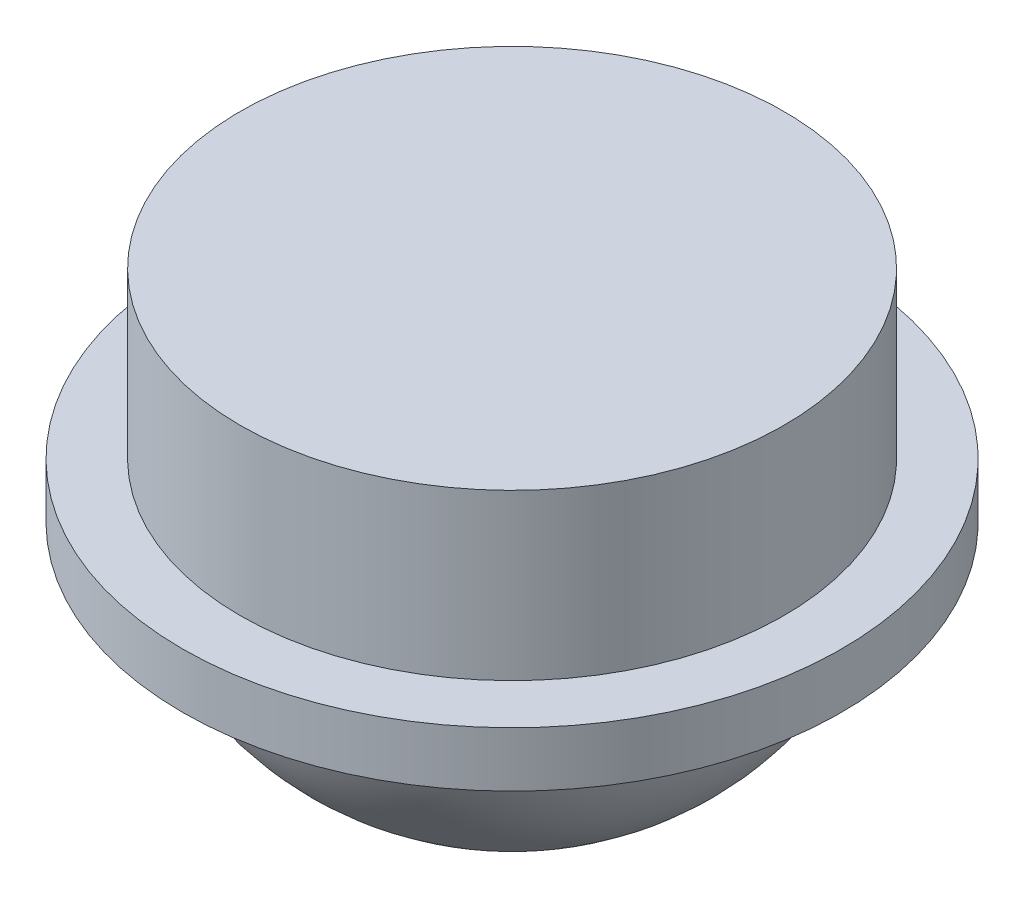
ISO-10303-21;
HEADER;
FILE_DESCRIPTION(('STEP AP214'),'2;1');
FILE_NAME('part.step','',(''),(''),'','','');
FILE_SCHEMA(('AUTOMOTIVE_DESIGN { 1 0 10303 214 1 1 1 1 }'));
ENDSEC;
DATA;
#1=APPLICATION_CONTEXT('core data for automotive mechanical design processes');
#2=APPLICATION_PROTOCOL_DEFINITION('international standard','automotive_design',2000,#1);
#3=PRODUCT_CONTEXT('',#1,'mechanical');
#4=PRODUCT('Part','Part','',(#3));
#5=PRODUCT_RELATED_PRODUCT_CATEGORY('part','',(#4));
#6=PRODUCT_DEFINITION_FORMATION('','',#4);
#7=PRODUCT_DEFINITION_CONTEXT('part definition',#1,'design');
#8=PRODUCT_DEFINITION('design','',#6,#7);
#9=PRODUCT_DEFINITION_SHAPE('','',#8);
#10=(LENGTH_UNIT() NAMED_UNIT(*) SI_UNIT(.MILLI.,.METRE.));
#11=(NAMED_UNIT(*) PLANE_ANGLE_UNIT() SI_UNIT($,.RADIAN.));
#12=(NAMED_UNIT(*) SI_UNIT($,.STERADIAN.) SOLID_ANGLE_UNIT());
#13=UNCERTAINTY_MEASURE_WITH_UNIT(LENGTH_MEASURE(1.E-05),#10,'distance_accuracy_value','');
#14=(GEOMETRIC_REPRESENTATION_CONTEXT(3) GLOBAL_UNCERTAINTY_ASSIGNED_CONTEXT((#13)) GLOBAL_UNIT_ASSIGNED_CONTEXT((#10,
#11,#12)) REPRESENTATION_CONTEXT('',''));
#15=CARTESIAN_POINT('',(0.,0.,0.));
#16=DIRECTION('',(0.,0.,1.));
#17=DIRECTION('',(1.,0.,0.));
#18=AXIS2_PLACEMENT_3D('',#15,#16,#17);
#19=CARTESIAN_POINT('',(60.0000008940697,-18.1999999999999,-44.1000000000083));
#20=DIRECTION('',(0.,1.,0.));
#21=DIRECTION('',(0.,0.,1.));
#22=AXIS2_PLACEMENT_3D('',#19,#20,#21);
#23=DEGENERATE_TOROIDAL_SURFACE('',#22,0.101020514433607,5.00000000000007,.T.);
#24=CARTESIAN_POINT('',(60.0000008940697,-23.2,-44.1000000000083));
#25=DIRECTION('',(0.,1.,0.));
#26=DIRECTION('',(0.,0.,1.));
#27=AXIS2_PLACEMENT_3D('',#24,#25,#26);
#28=CIRCLE('',#27,0.1010205144336);
#29=CARTESIAN_POINT('',(60.0000008940697,-23.2,-43.9989794855747));
#30=VERTEX_POINT('',#29);
#31=EDGE_CURVE('E10',#30,#30,#28,.T.);
#32=ORIENTED_EDGE('',*,*,#31,.T.);
#33=EDGE_LOOP('',(#32));
#34=FACE_BOUND('',#33,.T.);
#35=CARTESIAN_POINT('',(60.0000008940697,-19.2,-44.1000000000083));
#36=DIRECTION('',(0.,1.,0.));
#37=DIRECTION('',(0.,0.,1.));
#38=AXIS2_PLACEMENT_3D('',#35,#36,#37);
#39=CIRCLE('',#38,5.00000000000001);
#40=CARTESIAN_POINT('',(60.0000008940697,-19.2,-39.1000000000083));
#41=VERTEX_POINT('',#40);
#42=EDGE_CURVE('E53',#41,#41,#39,.T.);
#43=ORIENTED_EDGE('',*,*,#42,.F.);
#44=EDGE_LOOP('',(#43));
#45=FACE_BOUND('',#44,.T.);
#46=ADVANCED_FACE('F31',(#34,#45),#23,.T.);
#47=CARTESIAN_POINT('',(60.1010214085033,-23.2,-44.1000000000083));
#48=DIRECTION('',(0.,-1.,0.));
#49=DIRECTION('',(0.,0.,-1.));
#50=AXIS2_PLACEMENT_3D('',#47,#48,#49);
#51=PLANE('',#50);
#52=ORIENTED_EDGE('',*,*,#31,.F.);
#53=EDGE_LOOP('',(#52));
#54=FACE_BOUND('',#53,.T.);
#55=ADVANCED_FACE('F61',(#54),#51,.T.);
#56=CARTESIAN_POINT('',(60.0000008940697,-15.2,-44.1000000000083));
#57=DIRECTION('',(0.,1.,0.));
#58=DIRECTION('',(0.,0.,1.));
#59=AXIS2_PLACEMENT_3D('',#56,#57,#58);
#60=PLANE('',#59);
#61=CARTESIAN_POINT('',(60.0000008940697,-15.2,-44.1000000000083));
#62=DIRECTION('',(0.,1.,0.));
#63=DIRECTION('',(0.,0.,1.));
#64=AXIS2_PLACEMENT_3D('',#61,#62,#63);
#65=CIRCLE('',#64,4.95);
#66=CARTESIAN_POINT('',(60.0000008940697,-15.2,-39.1500000000083));
#67=VERTEX_POINT('',#66);
#68=EDGE_CURVE('E37',#67,#67,#65,.T.);
#69=ORIENTED_EDGE('',*,*,#68,.T.);
#70=EDGE_LOOP('',(#69));
#71=FACE_BOUND('',#70,.T.);
#72=ADVANCED_FACE('F65',(#71),#60,.T.);
#73=CARTESIAN_POINT('',(60.0000008940697,-23.2,-44.1000000000083));
#74=DIRECTION('',(0.,1.,0.));
#75=DIRECTION('',(0.,0.,1.));
#76=AXIS2_PLACEMENT_3D('',#73,#74,#75);
#77=CYLINDRICAL_SURFACE('',#76,4.95);
#78=CARTESIAN_POINT('',(60.0000008940697,-18.2,-44.1000000000083));
#79=DIRECTION('',(0.,1.,0.));
#80=DIRECTION('',(0.,0.,1.));
#81=AXIS2_PLACEMENT_3D('',#78,#79,#80);
#82=CIRCLE('',#81,4.95);
#83=CARTESIAN_POINT('',(60.0000008940697,-18.2,-39.1500000000083));
#84=VERTEX_POINT('',#83);
#85=EDGE_CURVE('E41',#84,#84,#82,.T.);
#86=ORIENTED_EDGE('',*,*,#85,.T.);
#87=EDGE_LOOP('',(#86));
#88=FACE_BOUND('',#87,.T.);
#89=ORIENTED_EDGE('',*,*,#68,.F.);
#90=EDGE_LOOP('',(#89));
#91=FACE_BOUND('',#90,.T.);
#92=ADVANCED_FACE('F70',(#88,#91),#77,.T.);
#93=CARTESIAN_POINT('',(64.9500008940697,-18.2,-44.1000000000083));
#94=DIRECTION('',(0.,1.,0.));
#95=DIRECTION('',(0.,0.,1.));
#96=AXIS2_PLACEMENT_3D('',#93,#94,#95);
#97=PLANE('',#96);
#98=CARTESIAN_POINT('',(60.0000008940697,-18.2,-44.1000000000083));
#99=DIRECTION('',(0.,1.,0.));
#100=DIRECTION('',(0.,0.,1.));
#101=AXIS2_PLACEMENT_3D('',#98,#99,#100);
#102=CIRCLE('',#101,6.);
#103=CARTESIAN_POINT('',(60.0000008940697,-18.2,-38.1000000000083));
#104=VERTEX_POINT('',#103);
#105=EDGE_CURVE('E45',#104,#104,#102,.T.);
#106=ORIENTED_EDGE('',*,*,#105,.T.);
#107=EDGE_LOOP('',(#106));
#108=FACE_BOUND('',#107,.T.);
#109=ORIENTED_EDGE('',*,*,#85,.F.);
#110=EDGE_LOOP('',(#109));
#111=FACE_BOUND('',#110,.T.);
#112=ADVANCED_FACE('F75',(#108,#111),#97,.T.);
#113=CARTESIAN_POINT('',(60.0000008940697,-23.2,-44.1000000000083));
#114=DIRECTION('',(0.,1.,0.));
#115=DIRECTION('',(0.,0.,1.));
#116=AXIS2_PLACEMENT_3D('',#113,#114,#115);
#117=CYLINDRICAL_SURFACE('',#116,6.);
#118=CARTESIAN_POINT('',(60.0000008940697,-19.2,-44.1000000000083));
#119=DIRECTION('',(0.,1.,0.));
#120=DIRECTION('',(0.,0.,1.));
#121=AXIS2_PLACEMENT_3D('',#118,#119,#120);
#122=CIRCLE('',#121,6.);
#123=CARTESIAN_POINT('',(60.0000008940697,-19.2,-38.1000000000083));
#124=VERTEX_POINT('',#123);
#125=EDGE_CURVE('E50',#124,#124,#122,.T.);
#126=ORIENTED_EDGE('',*,*,#125,.T.);
#127=EDGE_LOOP('',(#126));
#128=FACE_BOUND('',#127,.T.);
#129=ORIENTED_EDGE('',*,*,#105,.F.);
#130=EDGE_LOOP('',(#129));
#131=FACE_BOUND('',#130,.T.);
#132=ADVANCED_FACE('F79',(#128,#131),#117,.T.);
#133=CARTESIAN_POINT('',(66.0000008940697,-19.2,-44.1000000000083));
#134=DIRECTION('',(0.,-1.,0.));
#135=DIRECTION('',(0.,0.,-1.));
#136=AXIS2_PLACEMENT_3D('',#133,#134,#135);
#137=PLANE('',#136);
#138=ORIENTED_EDGE('',*,*,#42,.T.);
#139=EDGE_LOOP('',(#138));
#140=FACE_BOUND('',#139,.T.);
#141=ORIENTED_EDGE('',*,*,#125,.F.);
#142=EDGE_LOOP('',(#141));
#143=FACE_BOUND('',#142,.T.);
#144=ADVANCED_FACE('F57',(#140,#143),#137,.T.);
#145=CLOSED_SHELL('',(#46,#55,#72,#92,#112,#132,#144));
#146=MANIFOLD_SOLID_BREP('B2',#145);
#147=ADVANCED_BREP_SHAPE_REPRESENTATION('',(#18,#146),#14);
#148=SHAPE_DEFINITION_REPRESENTATION(#9,#147);
ENDSEC;
END-ISO-10303-21;
